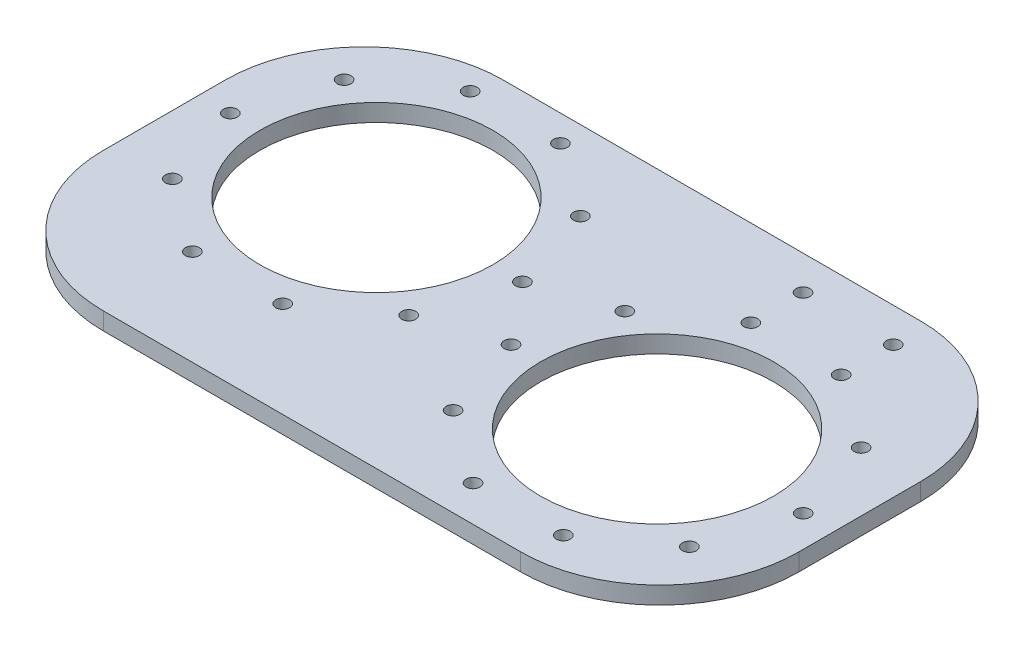
ISO-10303-21;
HEADER;
FILE_DESCRIPTION(('STEP AP214'),'2;1');
FILE_NAME('part.step','',(''),(''),'','','');
FILE_SCHEMA(('AUTOMOTIVE_DESIGN { 1 0 10303 214 1 1 1 1 }'));
ENDSEC;
DATA;
#1=APPLICATION_CONTEXT('core data for automotive mechanical design processes');
#2=APPLICATION_PROTOCOL_DEFINITION('international standard','automotive_design',2000,#1);
#3=PRODUCT_CONTEXT('',#1,'mechanical');
#4=PRODUCT('Part','Part','',(#3));
#5=PRODUCT_RELATED_PRODUCT_CATEGORY('part','',(#4));
#6=PRODUCT_DEFINITION_FORMATION('','',#4);
#7=PRODUCT_DEFINITION_CONTEXT('part definition',#1,'design');
#8=PRODUCT_DEFINITION('design','',#6,#7);
#9=PRODUCT_DEFINITION_SHAPE('','',#8);
#10=(LENGTH_UNIT() NAMED_UNIT(*) SI_UNIT(.MILLI.,.METRE.));
#11=(NAMED_UNIT(*) PLANE_ANGLE_UNIT() SI_UNIT($,.RADIAN.));
#12=(NAMED_UNIT(*) SI_UNIT($,.STERADIAN.) SOLID_ANGLE_UNIT());
#13=UNCERTAINTY_MEASURE_WITH_UNIT(LENGTH_MEASURE(1.E-05),#10,'distance_accuracy_value','');
#14=(GEOMETRIC_REPRESENTATION_CONTEXT(3) GLOBAL_UNCERTAINTY_ASSIGNED_CONTEXT((#13)) GLOBAL_UNIT_ASSIGNED_CONTEXT((#10,
#11,#12)) REPRESENTATION_CONTEXT('',''));
#15=CARTESIAN_POINT('',(0.,0.,0.));
#16=DIRECTION('',(0.,0.,1.));
#17=DIRECTION('',(1.,0.,0.));
#18=AXIS2_PLACEMENT_3D('',#15,#16,#17);
#19=CARTESIAN_POINT('',(-60.,5.,-17.5));
#20=DIRECTION('',(0.,-1.,0.));
#21=DIRECTION('',(0.,0.,-1.));
#22=AXIS2_PLACEMENT_3D('',#19,#20,#21);
#23=PLANE('',#22);
#24=CARTESIAN_POINT('',(36.021286236252,5.,-47.6643295749676));
#25=DIRECTION('',(0.,1.,0.));
#26=DIRECTION('',(0.,0.,1.));
#27=AXIS2_PLACEMENT_3D('',#24,#25,#26);
#28=CIRCLE('',#27,2.);
#29=CARTESIAN_POINT('',(36.021286236252,5.,-45.6643295749676));
#30=VERTEX_POINT('',#29);
#31=EDGE_CURVE('E270',#30,#30,#28,.T.);
#32=ORIENTED_EDGE('',*,*,#31,.F.);
#33=EDGE_LOOP('',(#32));
#34=FACE_BOUND('',#33,.T.);
#35=CARTESIAN_POINT('',(61.9787137637477,5.,-47.6643295749676));
#36=DIRECTION('',(0.,1.,0.));
#37=DIRECTION('',(0.,0.,1.));
#38=AXIS2_PLACEMENT_3D('',#35,#36,#37);
#39=CIRCLE('',#38,2.);
#40=CARTESIAN_POINT('',(61.9787137637477,5.,-45.6643295749676));
#41=VERTEX_POINT('',#40);
#42=EDGE_CURVE('E317',#41,#41,#39,.T.);
#43=ORIENTED_EDGE('',*,*,#42,.F.);
#44=EDGE_LOOP('',(#43));
#45=FACE_BOUND('',#44,.T.);
#46=CARTESIAN_POINT('',(-15.0212862362519,5.,14.6869805962834));
#47=DIRECTION('',(0.,1.,0.));
#48=DIRECTION('',(-0.587785252292462,0.,0.809016994374955));
#49=AXIS2_PLACEMENT_3D('',#46,#47,#48);
#50=CIRCLE('',#49,2.);
#51=CARTESIAN_POINT('',(-16.1968567408368,5.,16.3050145850333));
#52=VERTEX_POINT('',#51);
#53=EDGE_CURVE('E269',#52,#52,#50,.T.);
#54=ORIENTED_EDGE('',*,*,#53,.F.);
#55=EDGE_LOOP('',(#54));
#56=FACE_BOUND('',#55,.T.);
#57=CARTESIAN_POINT('',(-36.0212862362518,5.,29.9443736843963));
#58=DIRECTION('',(0.,1.,0.));
#59=DIRECTION('',(-0.95105651629515,0.,0.309016994374958));
#60=AXIS2_PLACEMENT_3D('',#57,#58,#59);
#61=CIRCLE('',#60,2.);
#62=CARTESIAN_POINT('',(-37.9233992688421,5.,30.5624076731462));
#63=VERTEX_POINT('',#62);
#64=EDGE_CURVE('E276',#63,#63,#61,.T.);
#65=ORIENTED_EDGE('',*,*,#64,.F.);
#66=EDGE_LOOP('',(#65));
#67=FACE_BOUND('',#66,.T.);
#68=CARTESIAN_POINT('',(-61.9787137637474,5.,29.9443736843966));
#69=DIRECTION('',(0.,1.,0.));
#70=DIRECTION('',(-0.951056516295157,0.,-0.309016994374938));
#71=AXIS2_PLACEMENT_3D('',#68,#69,#70);
#72=CIRCLE('',#71,2.);
#73=CARTESIAN_POINT('',(-63.8808267963377,5.,29.3263396956467));
#74=VERTEX_POINT('',#73);
#75=EDGE_CURVE('E282',#74,#74,#72,.T.);
#76=ORIENTED_EDGE('',*,*,#75,.F.);
#77=EDGE_LOOP('',(#76));
#78=FACE_BOUND('',#77,.T.);
#79=CARTESIAN_POINT('',(-82.9787137637476,5.,14.6869805962842));
#80=DIRECTION('',(0.,1.,0.));
#81=DIRECTION('',(-0.58778525229248,0.,-0.809016994374942));
#82=AXIS2_PLACEMENT_3D('',#79,#80,#81);
#83=CIRCLE('',#82,2.);
#84=CARTESIAN_POINT('',(-84.1542842683325,5.,13.0689466075343));
#85=VERTEX_POINT('',#84);
#86=EDGE_CURVE('E288',#85,#85,#83,.T.);
#87=ORIENTED_EDGE('',*,*,#86,.F.);
#88=EDGE_LOOP('',(#87));
#89=FACE_BOUND('',#88,.T.);
#90=CARTESIAN_POINT('',(-91.,5.,-10.));
#91=DIRECTION('',(0.,1.,0.));
#92=DIRECTION('',(0.,0.,-1.));
#93=AXIS2_PLACEMENT_3D('',#90,#91,#92);
#94=CIRCLE('',#93,2.);
#95=CARTESIAN_POINT('',(-91.,5.,-12.));
#96=VERTEX_POINT('',#95);
#97=EDGE_CURVE('E294',#96,#96,#94,.T.);
#98=ORIENTED_EDGE('',*,*,#97,.F.);
#99=EDGE_LOOP('',(#98));
#100=FACE_BOUND('',#99,.T.);
#101=CARTESIAN_POINT('',(-82.9787137637479,5.,-34.6869805962837));
#102=DIRECTION('',(0.,1.,0.));
#103=DIRECTION('',(0.587785252292469,0.,-0.809016994374951));
#104=AXIS2_PLACEMENT_3D('',#101,#102,#103);
#105=CIRCLE('',#104,2.);
#106=CARTESIAN_POINT('',(-81.803143259163,5.,-36.3050145850336));
#107=VERTEX_POINT('',#106);
#108=EDGE_CURVE('E300',#107,#107,#105,.T.);
#109=ORIENTED_EDGE('',*,*,#108,.F.);
#110=EDGE_LOOP('',(#109));
#111=FACE_BOUND('',#110,.T.);
#112=CARTESIAN_POINT('',(-61.978713763748,5.,-49.9443736843964));
#113=DIRECTION('',(0.,1.,0.));
#114=DIRECTION('',(0.951056516295152,0.,-0.309016994374952));
#115=AXIS2_PLACEMENT_3D('',#112,#113,#114);
#116=CIRCLE('',#115,2.);
#117=CARTESIAN_POINT('',(-60.0766007311577,5.,-50.5624076731463));
#118=VERTEX_POINT('',#117);
#119=EDGE_CURVE('E306',#118,#118,#116,.T.);
#120=ORIENTED_EDGE('',*,*,#119,.F.);
#121=EDGE_LOOP('',(#120));
#122=FACE_BOUND('',#121,.T.);
#123=CARTESIAN_POINT('',(-36.0212862362523,5.,-49.9443736843965));
#124=DIRECTION('',(0.,1.,0.));
#125=DIRECTION('',(0.951056516295155,0.,0.309016994374945));
#126=AXIS2_PLACEMENT_3D('',#123,#124,#125);
#127=CIRCLE('',#126,2.);
#128=CARTESIAN_POINT('',(-34.119173203662,5.,-49.3263396956466));
#129=VERTEX_POINT('',#128);
#130=EDGE_CURVE('E263',#129,#129,#127,.T.);
#131=ORIENTED_EDGE('',*,*,#130,.F.);
#132=EDGE_LOOP('',(#131));
#133=FACE_BOUND('',#132,.T.);
#134=CARTESIAN_POINT('',(-15.0212862362522,5.,-34.6869805962839));
#135=DIRECTION('',(0.,1.,0.));
#136=DIRECTION('',(0.587785252292474,0.,0.809016994374947));
#137=AXIS2_PLACEMENT_3D('',#134,#135,#136);
#138=CIRCLE('',#137,2.);
#139=CARTESIAN_POINT('',(-13.8457157316673,5.,-33.068946607534));
#140=VERTEX_POINT('',#139);
#141=EDGE_CURVE('E257',#140,#140,#138,.T.);
#142=ORIENTED_EDGE('',*,*,#141,.F.);
#143=EDGE_LOOP('',(#142));
#144=FACE_BOUND('',#143,.T.);
#145=CARTESIAN_POINT('',(-7.,5.,-10.));
#146=DIRECTION('',(0.,1.,0.));
#147=DIRECTION('',(0.,0.,1.));
#148=AXIS2_PLACEMENT_3D('',#145,#146,#147);
#149=CIRCLE('',#148,2.);
#150=CARTESIAN_POINT('',(-7.,5.,-8.));
#151=VERTEX_POINT('',#150);
#152=EDGE_CURVE('E210',#151,#151,#149,.T.);
#153=ORIENTED_EDGE('',*,*,#152,.F.);
#154=EDGE_LOOP('',(#153));
#155=FACE_BOUND('',#154,.T.);
#156=CARTESIAN_POINT('',(82.9787137637481,5.,31.9670247057123));
#157=DIRECTION('',(0.,1.,0.));
#158=DIRECTION('',(-0.587785252292462,0.,0.809016994374955));
#159=AXIS2_PLACEMENT_3D('',#156,#157,#158);
#160=CIRCLE('',#159,2.);
#161=CARTESIAN_POINT('',(81.8031432591632,5.,33.5850586944622));
#162=VERTEX_POINT('',#161);
#163=EDGE_CURVE('E209',#162,#162,#160,.T.);
#164=ORIENTED_EDGE('',*,*,#163,.F.);
#165=EDGE_LOOP('',(#164));
#166=FACE_BOUND('',#165,.T.);
#167=CARTESIAN_POINT('',(61.9787137637482,5.,47.2244177938252));
#168=DIRECTION('',(0.,1.,0.));
#169=DIRECTION('',(-0.95105651629515,0.,0.309016994374958));
#170=AXIS2_PLACEMENT_3D('',#167,#168,#169);
#171=CIRCLE('',#170,2.);
#172=CARTESIAN_POINT('',(60.0766007311579,5.,47.8424517825751));
#173=VERTEX_POINT('',#172);
#174=EDGE_CURVE('E216',#173,#173,#171,.T.);
#175=ORIENTED_EDGE('',*,*,#174,.F.);
#176=EDGE_LOOP('',(#175));
#177=FACE_BOUND('',#176,.T.);
#178=CARTESIAN_POINT('',(36.0212862362526,5.,47.2244177938254));
#179=DIRECTION('',(0.,1.,0.));
#180=DIRECTION('',(-0.951056516295157,0.,-0.309016994374938));
#181=AXIS2_PLACEMENT_3D('',#178,#179,#180);
#182=CIRCLE('',#181,2.);
#183=CARTESIAN_POINT('',(34.1191732036623,5.,46.6063838050756));
#184=VERTEX_POINT('',#183);
#185=EDGE_CURVE('E222',#184,#184,#182,.T.);
#186=ORIENTED_EDGE('',*,*,#185,.F.);
#187=EDGE_LOOP('',(#186));
#188=FACE_BOUND('',#187,.T.);
#189=CARTESIAN_POINT('',(15.0212862362524,5.,31.967024705713));
#190=DIRECTION('',(0.,1.,0.));
#191=DIRECTION('',(-0.58778525229248,0.,-0.809016994374942));
#192=AXIS2_PLACEMENT_3D('',#189,#190,#191);
#193=CIRCLE('',#192,2.);
#194=CARTESIAN_POINT('',(13.8457157316675,5.,30.3489907169632));
#195=VERTEX_POINT('',#194);
#196=EDGE_CURVE('E228',#195,#195,#193,.T.);
#197=ORIENTED_EDGE('',*,*,#196,.F.);
#198=EDGE_LOOP('',(#197));
#199=FACE_BOUND('',#198,.T.);
#200=CARTESIAN_POINT('',(7.00000000000001,5.,7.28004410942886));
#201=DIRECTION('',(0.,1.,0.));
#202=DIRECTION('',(0.,0.,-1.));
#203=AXIS2_PLACEMENT_3D('',#200,#201,#202);
#204=CIRCLE('',#203,2.);
#205=CARTESIAN_POINT('',(7.00000000000001,5.,5.28004410942887));
#206=VERTEX_POINT('',#205);
#207=EDGE_CURVE('E234',#206,#206,#204,.T.);
#208=ORIENTED_EDGE('',*,*,#207,.F.);
#209=EDGE_LOOP('',(#208));
#210=FACE_BOUND('',#209,.T.);
#211=CARTESIAN_POINT('',(15.0212862362521,5.,-17.4069364868548));
#212=DIRECTION('',(0.,1.,0.));
#213=DIRECTION('',(0.587785252292469,0.,-0.809016994374951));
#214=AXIS2_PLACEMENT_3D('',#211,#212,#213);
#215=CIRCLE('',#214,2.);
#216=CARTESIAN_POINT('',(16.196856740837,5.,-19.0249704756047));
#217=VERTEX_POINT('',#216);
#218=EDGE_CURVE('E240',#217,#217,#215,.T.);
#219=ORIENTED_EDGE('',*,*,#218,.F.);
#220=EDGE_LOOP('',(#219));
#221=FACE_BOUND('',#220,.T.);
#222=CARTESIAN_POINT('',(36.021286236252,5.,-32.6643295749675));
#223=DIRECTION('',(0.,1.,0.));
#224=DIRECTION('',(0.951056516295152,0.,-0.309016994374952));
#225=AXIS2_PLACEMENT_3D('',#222,#223,#224);
#226=CIRCLE('',#225,2.);
#227=CARTESIAN_POINT('',(37.9233992688423,5.,-33.2823635637174));
#228=VERTEX_POINT('',#227);
#229=EDGE_CURVE('E246',#228,#228,#226,.T.);
#230=ORIENTED_EDGE('',*,*,#229,.F.);
#231=EDGE_LOOP('',(#230));
#232=FACE_BOUND('',#231,.T.);
#233=CARTESIAN_POINT('',(61.9787137637477,5.,-32.6643295749676));
#234=DIRECTION('',(0.,1.,0.));
#235=DIRECTION('',(0.951056516295155,0.,0.309016994374945));
#236=AXIS2_PLACEMENT_3D('',#233,#234,#235);
#237=CIRCLE('',#236,2.);
#238=CARTESIAN_POINT('',(63.880826796338,5.,-32.0462955862177));
#239=VERTEX_POINT('',#238);
#240=EDGE_CURVE('E203',#239,#239,#237,.T.);
#241=ORIENTED_EDGE('',*,*,#240,.F.);
#242=EDGE_LOOP('',(#241));
#243=FACE_BOUND('',#242,.T.);
#244=CARTESIAN_POINT('',(82.9787137637477,5.,-17.4069364868551));
#245=DIRECTION('',(0.,1.,0.));
#246=DIRECTION('',(0.587785252292474,0.,0.809016994374947));
#247=AXIS2_PLACEMENT_3D('',#244,#245,#246);
#248=CIRCLE('',#247,2.);
#249=CARTESIAN_POINT('',(84.1542842683327,5.,-15.7889024981052));
#250=VERTEX_POINT('',#249);
#251=EDGE_CURVE('E197',#250,#250,#248,.T.);
#252=ORIENTED_EDGE('',*,*,#251,.F.);
#253=EDGE_LOOP('',(#252));
#254=FACE_BOUND('',#253,.T.);
#255=CARTESIAN_POINT('',(91.,5.,7.28004410942886));
#256=DIRECTION('',(0.,1.,0.));
#257=DIRECTION('',(0.,0.,1.));
#258=AXIS2_PLACEMENT_3D('',#255,#256,#257);
#259=CIRCLE('',#258,2.);
#260=CARTESIAN_POINT('',(91.,5.,9.28004410942886));
#261=VERTEX_POINT('',#260);
#262=EDGE_CURVE('E191',#261,#261,#259,.T.);
#263=ORIENTED_EDGE('',*,*,#262,.F.);
#264=EDGE_LOOP('',(#263));
#265=FACE_BOUND('',#264,.T.);
#266=CARTESIAN_POINT('',(-60.,5.,-17.5));
#267=DIRECTION('',(0.,1.,0.));
#268=DIRECTION('',(0.,0.,-1.));
#269=AXIS2_PLACEMENT_3D('',#266,#267,#268);
#270=CIRCLE('',#269,40.);
#271=CARTESIAN_POINT('',(-60.,5.,-57.5));
#272=VERTEX_POINT('',#271);
#273=CARTESIAN_POINT('',(-100.,5.,-17.5));
#274=VERTEX_POINT('',#273);
#275=EDGE_CURVE('E148',#272,#274,#270,.T.);
#276=ORIENTED_EDGE('',*,*,#275,.T.);
#277=DIRECTION('',(0.,0.,1.));
#278=VECTOR('',#277,1.);
#279=CARTESIAN_POINT('',(-100.,5.,-17.5));
#280=LINE('',#279,#278);
#281=CARTESIAN_POINT('',(-100.,5.,17.5));
#282=VERTEX_POINT('',#281);
#283=EDGE_CURVE('E96',#274,#282,#280,.T.);
#284=ORIENTED_EDGE('',*,*,#283,.T.);
#285=CARTESIAN_POINT('',(-60.,5.,17.5));
#286=DIRECTION('',(0.,1.,0.));
#287=DIRECTION('',(0.,0.,-1.));
#288=AXIS2_PLACEMENT_3D('',#285,#286,#287);
#289=CIRCLE('',#288,40.);
#290=CARTESIAN_POINT('',(-60.,5.,57.5));
#291=VERTEX_POINT('',#290);
#292=EDGE_CURVE('E163',#282,#291,#289,.T.);
#293=ORIENTED_EDGE('',*,*,#292,.T.);
#294=DIRECTION('',(1.,0.,0.));
#295=VECTOR('',#294,1.);
#296=CARTESIAN_POINT('',(-60.,5.,57.5));
#297=LINE('',#296,#295);
#298=CARTESIAN_POINT('',(60.,5.,57.5));
#299=VERTEX_POINT('',#298);
#300=EDGE_CURVE('E176',#291,#299,#297,.T.);
#301=ORIENTED_EDGE('',*,*,#300,.T.);
#302=CARTESIAN_POINT('',(60.,5.,17.5));
#303=DIRECTION('',(0.,1.,0.));
#304=DIRECTION('',(0.,0.,1.));
#305=AXIS2_PLACEMENT_3D('',#302,#303,#304);
#306=CIRCLE('',#305,40.);
#307=CARTESIAN_POINT('',(100.,5.,17.5));
#308=VERTEX_POINT('',#307);
#309=EDGE_CURVE('E115',#299,#308,#306,.T.);
#310=ORIENTED_EDGE('',*,*,#309,.T.);
#311=DIRECTION('',(0.,0.,-1.));
#312=VECTOR('',#311,1.);
#313=CARTESIAN_POINT('',(100.,5.,-17.5));
#314=LINE('',#313,#312);
#315=CARTESIAN_POINT('',(100.,5.,-17.5));
#316=VERTEX_POINT('',#315);
#317=EDGE_CURVE('E109',#308,#316,#314,.T.);
#318=ORIENTED_EDGE('',*,*,#317,.T.);
#319=CARTESIAN_POINT('',(60.,5.,-17.5));
#320=DIRECTION('',(0.,1.,0.));
#321=DIRECTION('',(0.,0.,1.));
#322=AXIS2_PLACEMENT_3D('',#319,#320,#321);
#323=CIRCLE('',#322,40.);
#324=CARTESIAN_POINT('',(60.,5.,-57.5));
#325=VERTEX_POINT('',#324);
#326=EDGE_CURVE('E113',#316,#325,#323,.T.);
#327=ORIENTED_EDGE('',*,*,#326,.T.);
#328=DIRECTION('',(-1.,0.,0.));
#329=VECTOR('',#328,1.);
#330=CARTESIAN_POINT('',(-60.,5.,-57.5));
#331=LINE('',#330,#329);
#332=EDGE_CURVE('E53',#325,#272,#331,.T.);
#333=ORIENTED_EDGE('',*,*,#332,.T.);
#334=EDGE_LOOP('',(#276,#284,#293,#301,#310,#318,#327,#333));
#335=FACE_BOUND('',#334,.T.);
#336=CARTESIAN_POINT('',(-49.,5.,-10.));
#337=DIRECTION('',(0.,1.,0.));
#338=DIRECTION('',(0.,0.,1.));
#339=AXIS2_PLACEMENT_3D('',#336,#337,#338);
#340=CIRCLE('',#339,33.5);
#341=CARTESIAN_POINT('',(-49.,5.,23.5));
#342=VERTEX_POINT('',#341);
#343=EDGE_CURVE('E137',#342,#342,#340,.T.);
#344=ORIENTED_EDGE('',*,*,#343,.F.);
#345=EDGE_LOOP('',(#344));
#346=FACE_BOUND('',#345,.T.);
#347=CARTESIAN_POINT('',(49.,5.,7.28004410942886));
#348=DIRECTION('',(0.,1.,0.));
#349=DIRECTION('',(0.,0.,1.));
#350=AXIS2_PLACEMENT_3D('',#347,#348,#349);
#351=CIRCLE('',#350,33.5);
#352=CARTESIAN_POINT('',(49.,5.,40.7800441094289));
#353=VERTEX_POINT('',#352);
#354=EDGE_CURVE('E185',#353,#353,#351,.T.);
#355=ORIENTED_EDGE('',*,*,#354,.F.);
#356=EDGE_LOOP('',(#355));
#357=FACE_BOUND('',#356,.T.);
#358=ADVANCED_FACE('F36',(#34,#45,#56,#67,#78,#89,#100,#111,#122,#133,#144,#155,#166,#177,#188,
#199,#210,#221,#232,#243,#254,#265,#335,#346,#357),#23,.F.);
#359=CARTESIAN_POINT('',(-60.,0.,-17.5));
#360=DIRECTION('',(0.,-1.,0.));
#361=DIRECTION('',(0.,0.,-1.));
#362=AXIS2_PLACEMENT_3D('',#359,#360,#361);
#363=PLANE('',#362);
#364=CARTESIAN_POINT('',(36.021286236252,0.,-47.6643295749676));
#365=DIRECTION('',(0.,-1.,0.));
#366=DIRECTION('',(0.,0.,-1.));
#367=AXIS2_PLACEMENT_3D('',#364,#365,#366);
#368=CIRCLE('',#367,2.);
#369=CARTESIAN_POINT('',(36.021286236252,0.,-49.6643295749676));
#370=VERTEX_POINT('',#369);
#371=EDGE_CURVE('E320',#370,#370,#368,.F.);
#372=ORIENTED_EDGE('',*,*,#371,.T.);
#373=EDGE_LOOP('',(#372));
#374=FACE_BOUND('',#373,.T.);
#375=CARTESIAN_POINT('',(61.9787137637477,0.,-47.6643295749676));
#376=DIRECTION('',(0.,-1.,0.));
#377=DIRECTION('',(0.,0.,-1.));
#378=AXIS2_PLACEMENT_3D('',#375,#376,#377);
#379=CIRCLE('',#378,2.);
#380=CARTESIAN_POINT('',(61.9787137637477,0.,-49.6643295749676));
#381=VERTEX_POINT('',#380);
#382=EDGE_CURVE('E314',#381,#381,#379,.F.);
#383=ORIENTED_EDGE('',*,*,#382,.T.);
#384=EDGE_LOOP('',(#383));
#385=FACE_BOUND('',#384,.T.);
#386=CARTESIAN_POINT('',(-15.0212862362519,0.,14.6869805962834));
#387=DIRECTION('',(0.,-1.,0.));
#388=DIRECTION('',(0.,0.,-1.));
#389=AXIS2_PLACEMENT_3D('',#386,#387,#388);
#390=CIRCLE('',#389,2.);
#391=CARTESIAN_POINT('',(-15.0212862362519,0.,12.6869805962834));
#392=VERTEX_POINT('',#391);
#393=EDGE_CURVE('E266',#392,#392,#390,.F.);
#394=ORIENTED_EDGE('',*,*,#393,.T.);
#395=EDGE_LOOP('',(#394));
#396=FACE_BOUND('',#395,.T.);
#397=CARTESIAN_POINT('',(-36.0212862362518,0.,29.9443736843963));
#398=DIRECTION('',(0.,-1.,0.));
#399=DIRECTION('',(0.,0.,-1.));
#400=AXIS2_PLACEMENT_3D('',#397,#398,#399);
#401=CIRCLE('',#400,2.);
#402=CARTESIAN_POINT('',(-36.0212862362518,0.,27.9443736843963));
#403=VERTEX_POINT('',#402);
#404=EDGE_CURVE('E273',#403,#403,#401,.F.);
#405=ORIENTED_EDGE('',*,*,#404,.T.);
#406=EDGE_LOOP('',(#405));
#407=FACE_BOUND('',#406,.T.);
#408=CARTESIAN_POINT('',(-61.9787137637474,0.,29.9443736843966));
#409=DIRECTION('',(0.,-1.,0.));
#410=DIRECTION('',(0.,0.,-1.));
#411=AXIS2_PLACEMENT_3D('',#408,#409,#410);
#412=CIRCLE('',#411,2.);
#413=CARTESIAN_POINT('',(-61.9787137637474,0.,27.9443736843966));
#414=VERTEX_POINT('',#413);
#415=EDGE_CURVE('E279',#414,#414,#412,.F.);
#416=ORIENTED_EDGE('',*,*,#415,.T.);
#417=EDGE_LOOP('',(#416));
#418=FACE_BOUND('',#417,.T.);
#419=CARTESIAN_POINT('',(-82.9787137637476,0.,14.6869805962842));
#420=DIRECTION('',(0.,-1.,0.));
#421=DIRECTION('',(0.,0.,-1.));
#422=AXIS2_PLACEMENT_3D('',#419,#420,#421);
#423=CIRCLE('',#422,2.);
#424=CARTESIAN_POINT('',(-82.9787137637476,0.,12.6869805962842));
#425=VERTEX_POINT('',#424);
#426=EDGE_CURVE('E285',#425,#425,#423,.F.);
#427=ORIENTED_EDGE('',*,*,#426,.T.);
#428=EDGE_LOOP('',(#427));
#429=FACE_BOUND('',#428,.T.);
#430=CARTESIAN_POINT('',(-91.,0.,-10.));
#431=DIRECTION('',(0.,-1.,0.));
#432=DIRECTION('',(0.,0.,-1.));
#433=AXIS2_PLACEMENT_3D('',#430,#431,#432);
#434=CIRCLE('',#433,2.);
#435=CARTESIAN_POINT('',(-91.,0.,-12.));
#436=VERTEX_POINT('',#435);
#437=EDGE_CURVE('E291',#436,#436,#434,.F.);
#438=ORIENTED_EDGE('',*,*,#437,.T.);
#439=EDGE_LOOP('',(#438));
#440=FACE_BOUND('',#439,.T.);
#441=CARTESIAN_POINT('',(-82.9787137637479,0.,-34.6869805962837));
#442=DIRECTION('',(0.,-1.,0.));
#443=DIRECTION('',(0.,0.,-1.));
#444=AXIS2_PLACEMENT_3D('',#441,#442,#443);
#445=CIRCLE('',#444,2.);
#446=CARTESIAN_POINT('',(-82.9787137637479,0.,-36.6869805962837));
#447=VERTEX_POINT('',#446);
#448=EDGE_CURVE('E297',#447,#447,#445,.F.);
#449=ORIENTED_EDGE('',*,*,#448,.T.);
#450=EDGE_LOOP('',(#449));
#451=FACE_BOUND('',#450,.T.);
#452=CARTESIAN_POINT('',(-61.978713763748,0.,-49.9443736843964));
#453=DIRECTION('',(0.,-1.,0.));
#454=DIRECTION('',(0.,0.,-1.));
#455=AXIS2_PLACEMENT_3D('',#452,#453,#454);
#456=CIRCLE('',#455,2.);
#457=CARTESIAN_POINT('',(-61.978713763748,0.,-51.9443736843964));
#458=VERTEX_POINT('',#457);
#459=EDGE_CURVE('E303',#458,#458,#456,.F.);
#460=ORIENTED_EDGE('',*,*,#459,.T.);
#461=EDGE_LOOP('',(#460));
#462=FACE_BOUND('',#461,.T.);
#463=CARTESIAN_POINT('',(-36.0212862362523,0.,-49.9443736843965));
#464=DIRECTION('',(0.,-1.,0.));
#465=DIRECTION('',(0.,0.,-1.));
#466=AXIS2_PLACEMENT_3D('',#463,#464,#465);
#467=CIRCLE('',#466,2.);
#468=CARTESIAN_POINT('',(-36.0212862362523,0.,-51.9443736843965));
#469=VERTEX_POINT('',#468);
#470=EDGE_CURVE('E309',#469,#469,#467,.F.);
#471=ORIENTED_EDGE('',*,*,#470,.T.);
#472=EDGE_LOOP('',(#471));
#473=FACE_BOUND('',#472,.T.);
#474=CARTESIAN_POINT('',(-15.0212862362522,0.,-34.6869805962839));
#475=DIRECTION('',(0.,-1.,0.));
#476=DIRECTION('',(0.,0.,-1.));
#477=AXIS2_PLACEMENT_3D('',#474,#475,#476);
#478=CIRCLE('',#477,2.);
#479=CARTESIAN_POINT('',(-15.0212862362522,0.,-36.6869805962839));
#480=VERTEX_POINT('',#479);
#481=EDGE_CURVE('E260',#480,#480,#478,.F.);
#482=ORIENTED_EDGE('',*,*,#481,.T.);
#483=EDGE_LOOP('',(#482));
#484=FACE_BOUND('',#483,.T.);
#485=CARTESIAN_POINT('',(-7.,0.,-10.));
#486=DIRECTION('',(0.,-1.,0.));
#487=DIRECTION('',(0.,0.,-1.));
#488=AXIS2_PLACEMENT_3D('',#485,#486,#487);
#489=CIRCLE('',#488,2.);
#490=CARTESIAN_POINT('',(-7.,0.,-12.));
#491=VERTEX_POINT('',#490);
#492=EDGE_CURVE('E254',#491,#491,#489,.F.);
#493=ORIENTED_EDGE('',*,*,#492,.T.);
#494=EDGE_LOOP('',(#493));
#495=FACE_BOUND('',#494,.T.);
#496=CARTESIAN_POINT('',(82.9787137637481,0.,31.9670247057123));
#497=DIRECTION('',(0.,-1.,0.));
#498=DIRECTION('',(0.,0.,-1.));
#499=AXIS2_PLACEMENT_3D('',#496,#497,#498);
#500=CIRCLE('',#499,2.);
#501=CARTESIAN_POINT('',(82.9787137637481,0.,29.9670247057123));
#502=VERTEX_POINT('',#501);
#503=EDGE_CURVE('E206',#502,#502,#500,.F.);
#504=ORIENTED_EDGE('',*,*,#503,.T.);
#505=EDGE_LOOP('',(#504));
#506=FACE_BOUND('',#505,.T.);
#507=CARTESIAN_POINT('',(61.9787137637482,0.,47.2244177938252));
#508=DIRECTION('',(0.,-1.,0.));
#509=DIRECTION('',(0.,0.,-1.));
#510=AXIS2_PLACEMENT_3D('',#507,#508,#509);
#511=CIRCLE('',#510,2.);
#512=CARTESIAN_POINT('',(61.9787137637482,0.,45.2244177938252));
#513=VERTEX_POINT('',#512);
#514=EDGE_CURVE('E213',#513,#513,#511,.F.);
#515=ORIENTED_EDGE('',*,*,#514,.T.);
#516=EDGE_LOOP('',(#515));
#517=FACE_BOUND('',#516,.T.);
#518=CARTESIAN_POINT('',(36.0212862362526,0.,47.2244177938254));
#519=DIRECTION('',(0.,-1.,0.));
#520=DIRECTION('',(0.,0.,-1.));
#521=AXIS2_PLACEMENT_3D('',#518,#519,#520);
#522=CIRCLE('',#521,2.);
#523=CARTESIAN_POINT('',(36.0212862362526,0.,45.2244177938254));
#524=VERTEX_POINT('',#523);
#525=EDGE_CURVE('E219',#524,#524,#522,.F.);
#526=ORIENTED_EDGE('',*,*,#525,.T.);
#527=EDGE_LOOP('',(#526));
#528=FACE_BOUND('',#527,.T.);
#529=CARTESIAN_POINT('',(15.0212862362524,0.,31.967024705713));
#530=DIRECTION('',(0.,-1.,0.));
#531=DIRECTION('',(0.,0.,-1.));
#532=AXIS2_PLACEMENT_3D('',#529,#530,#531);
#533=CIRCLE('',#532,2.);
#534=CARTESIAN_POINT('',(15.0212862362524,0.,29.967024705713));
#535=VERTEX_POINT('',#534);
#536=EDGE_CURVE('E225',#535,#535,#533,.F.);
#537=ORIENTED_EDGE('',*,*,#536,.T.);
#538=EDGE_LOOP('',(#537));
#539=FACE_BOUND('',#538,.T.);
#540=CARTESIAN_POINT('',(7.00000000000001,0.,7.28004410942886));
#541=DIRECTION('',(0.,-1.,0.));
#542=DIRECTION('',(0.,0.,-1.));
#543=AXIS2_PLACEMENT_3D('',#540,#541,#542);
#544=CIRCLE('',#543,2.);
#545=CARTESIAN_POINT('',(7.00000000000001,0.,5.28004410942887));
#546=VERTEX_POINT('',#545);
#547=EDGE_CURVE('E231',#546,#546,#544,.F.);
#548=ORIENTED_EDGE('',*,*,#547,.T.);
#549=EDGE_LOOP('',(#548));
#550=FACE_BOUND('',#549,.T.);
#551=CARTESIAN_POINT('',(15.0212862362521,0.,-17.4069364868548));
#552=DIRECTION('',(0.,-1.,0.));
#553=DIRECTION('',(0.,0.,-1.));
#554=AXIS2_PLACEMENT_3D('',#551,#552,#553);
#555=CIRCLE('',#554,2.);
#556=CARTESIAN_POINT('',(15.0212862362521,0.,-19.4069364868548));
#557=VERTEX_POINT('',#556);
#558=EDGE_CURVE('E237',#557,#557,#555,.F.);
#559=ORIENTED_EDGE('',*,*,#558,.T.);
#560=EDGE_LOOP('',(#559));
#561=FACE_BOUND('',#560,.T.);
#562=CARTESIAN_POINT('',(36.021286236252,0.,-32.6643295749675));
#563=DIRECTION('',(0.,-1.,0.));
#564=DIRECTION('',(0.,0.,-1.));
#565=AXIS2_PLACEMENT_3D('',#562,#563,#564);
#566=CIRCLE('',#565,2.);
#567=CARTESIAN_POINT('',(36.021286236252,0.,-34.6643295749675));
#568=VERTEX_POINT('',#567);
#569=EDGE_CURVE('E243',#568,#568,#566,.F.);
#570=ORIENTED_EDGE('',*,*,#569,.T.);
#571=EDGE_LOOP('',(#570));
#572=FACE_BOUND('',#571,.T.);
#573=CARTESIAN_POINT('',(61.9787137637477,0.,-32.6643295749676));
#574=DIRECTION('',(0.,-1.,0.));
#575=DIRECTION('',(0.,0.,-1.));
#576=AXIS2_PLACEMENT_3D('',#573,#574,#575);
#577=CIRCLE('',#576,2.);
#578=CARTESIAN_POINT('',(61.9787137637477,0.,-34.6643295749676));
#579=VERTEX_POINT('',#578);
#580=EDGE_CURVE('E249',#579,#579,#577,.F.);
#581=ORIENTED_EDGE('',*,*,#580,.T.);
#582=EDGE_LOOP('',(#581));
#583=FACE_BOUND('',#582,.T.);
#584=CARTESIAN_POINT('',(82.9787137637477,0.,-17.4069364868551));
#585=DIRECTION('',(0.,-1.,0.));
#586=DIRECTION('',(0.,0.,-1.));
#587=AXIS2_PLACEMENT_3D('',#584,#585,#586);
#588=CIRCLE('',#587,2.);
#589=CARTESIAN_POINT('',(82.9787137637477,0.,-19.406936486855));
#590=VERTEX_POINT('',#589);
#591=EDGE_CURVE('E200',#590,#590,#588,.F.);
#592=ORIENTED_EDGE('',*,*,#591,.T.);
#593=EDGE_LOOP('',(#592));
#594=FACE_BOUND('',#593,.T.);
#595=CARTESIAN_POINT('',(91.,0.,7.28004410942886));
#596=DIRECTION('',(0.,-1.,0.));
#597=DIRECTION('',(0.,0.,-1.));
#598=AXIS2_PLACEMENT_3D('',#595,#596,#597);
#599=CIRCLE('',#598,2.);
#600=CARTESIAN_POINT('',(91.,0.,5.28004410942887));
#601=VERTEX_POINT('',#600);
#602=EDGE_CURVE('E194',#601,#601,#599,.F.);
#603=ORIENTED_EDGE('',*,*,#602,.T.);
#604=EDGE_LOOP('',(#603));
#605=FACE_BOUND('',#604,.T.);
#606=CARTESIAN_POINT('',(-49.,0.,-10.));
#607=DIRECTION('',(0.,1.,0.));
#608=DIRECTION('',(0.,0.,1.));
#609=AXIS2_PLACEMENT_3D('',#606,#607,#608);
#610=CIRCLE('',#609,33.5);
#611=CARTESIAN_POINT('',(-49.,0.,23.5));
#612=VERTEX_POINT('',#611);
#613=EDGE_CURVE('E182',#612,#612,#610,.T.);
#614=ORIENTED_EDGE('',*,*,#613,.T.);
#615=EDGE_LOOP('',(#614));
#616=FACE_BOUND('',#615,.T.);
#617=CARTESIAN_POINT('',(-60.,0.,-17.5));
#618=DIRECTION('',(0.,1.,0.));
#619=DIRECTION('',(0.,0.,-1.));
#620=AXIS2_PLACEMENT_3D('',#617,#618,#619);
#621=CIRCLE('',#620,40.);
#622=CARTESIAN_POINT('',(-60.,0.,-57.5));
#623=VERTEX_POINT('',#622);
#624=CARTESIAN_POINT('',(-100.,0.,-17.5));
#625=VERTEX_POINT('',#624);
#626=EDGE_CURVE('E133',#623,#625,#621,.T.);
#627=ORIENTED_EDGE('',*,*,#626,.F.);
#628=DIRECTION('',(-1.,0.,0.));
#629=VECTOR('',#628,1.);
#630=CARTESIAN_POINT('',(-60.,0.,-57.5));
#631=LINE('',#630,#629);
#632=CARTESIAN_POINT('',(60.,0.,-57.5));
#633=VERTEX_POINT('',#632);
#634=EDGE_CURVE('E88',#633,#623,#631,.T.);
#635=ORIENTED_EDGE('',*,*,#634,.F.);
#636=CARTESIAN_POINT('',(60.,0.,-17.5));
#637=DIRECTION('',(0.,1.,0.));
#638=DIRECTION('',(0.,0.,1.));
#639=AXIS2_PLACEMENT_3D('',#636,#637,#638);
#640=CIRCLE('',#639,40.);
#641=CARTESIAN_POINT('',(100.,0.,-17.5));
#642=VERTEX_POINT('',#641);
#643=EDGE_CURVE('E82',#642,#633,#640,.T.);
#644=ORIENTED_EDGE('',*,*,#643,.F.);
#645=DIRECTION('',(0.,0.,-1.));
#646=VECTOR('',#645,1.);
#647=CARTESIAN_POINT('',(100.,0.,-17.5));
#648=LINE('',#647,#646);
#649=CARTESIAN_POINT('',(100.,0.,17.5));
#650=VERTEX_POINT('',#649);
#651=EDGE_CURVE('E123',#650,#642,#648,.T.);
#652=ORIENTED_EDGE('',*,*,#651,.F.);
#653=CARTESIAN_POINT('',(60.,0.,17.5));
#654=DIRECTION('',(0.,1.,0.));
#655=DIRECTION('',(0.,0.,1.));
#656=AXIS2_PLACEMENT_3D('',#653,#654,#655);
#657=CIRCLE('',#656,40.);
#658=CARTESIAN_POINT('',(60.,0.,57.5));
#659=VERTEX_POINT('',#658);
#660=EDGE_CURVE('E143',#659,#650,#657,.T.);
#661=ORIENTED_EDGE('',*,*,#660,.F.);
#662=DIRECTION('',(1.,0.,0.));
#663=VECTOR('',#662,1.);
#664=CARTESIAN_POINT('',(-60.,0.,57.5));
#665=LINE('',#664,#663);
#666=CARTESIAN_POINT('',(-60.,0.,57.5));
#667=VERTEX_POINT('',#666);
#668=EDGE_CURVE('E141',#667,#659,#665,.T.);
#669=ORIENTED_EDGE('',*,*,#668,.F.);
#670=CARTESIAN_POINT('',(-60.,0.,17.5));
#671=DIRECTION('',(0.,1.,0.));
#672=DIRECTION('',(0.,0.,-1.));
#673=AXIS2_PLACEMENT_3D('',#670,#671,#672);
#674=CIRCLE('',#673,40.);
#675=CARTESIAN_POINT('',(-100.,0.,17.5));
#676=VERTEX_POINT('',#675);
#677=EDGE_CURVE('E139',#676,#667,#674,.T.);
#678=ORIENTED_EDGE('',*,*,#677,.F.);
#679=DIRECTION('',(0.,0.,1.));
#680=VECTOR('',#679,1.);
#681=CARTESIAN_POINT('',(-100.,0.,-17.5));
#682=LINE('',#681,#680);
#683=EDGE_CURVE('E136',#625,#676,#682,.T.);
#684=ORIENTED_EDGE('',*,*,#683,.F.);
#685=EDGE_LOOP('',(#627,#635,#644,#652,#661,#669,#678,#684));
#686=FACE_BOUND('',#685,.T.);
#687=CARTESIAN_POINT('',(49.,0.,7.28004410942886));
#688=DIRECTION('',(0.,1.,0.));
#689=DIRECTION('',(0.,0.,1.));
#690=AXIS2_PLACEMENT_3D('',#687,#688,#689);
#691=CIRCLE('',#690,33.5);
#692=CARTESIAN_POINT('',(49.,0.,40.7800441094289));
#693=VERTEX_POINT('',#692);
#694=EDGE_CURVE('E188',#693,#693,#691,.T.);
#695=ORIENTED_EDGE('',*,*,#694,.T.);
#696=EDGE_LOOP('',(#695));
#697=FACE_BOUND('',#696,.T.);
#698=ADVANCED_FACE('F167',(#374,#385,#396,#407,#418,#429,#440,#451,#462,#473,#484,#495,#506,
#517,#528,#539,#550,#561,#572,#583,#594,#605,#616,#686,#697),#363,.T.);
#699=CARTESIAN_POINT('',(-60.,5.,-17.5));
#700=DIRECTION('',(0.,-1.,0.));
#701=DIRECTION('',(0.,0.,-1.));
#702=AXIS2_PLACEMENT_3D('',#699,#700,#701);
#703=CYLINDRICAL_SURFACE('',#702,40.);
#704=ORIENTED_EDGE('',*,*,#626,.T.);
#705=DIRECTION('',(0.,-1.,0.));
#706=VECTOR('',#705,1.);
#707=CARTESIAN_POINT('',(-100.,5.,-17.5));
#708=LINE('',#707,#706);
#709=EDGE_CURVE('E11',#274,#625,#708,.T.);
#710=ORIENTED_EDGE('',*,*,#709,.F.);
#711=ORIENTED_EDGE('',*,*,#275,.F.);
#712=DIRECTION('',(0.,-1.,0.));
#713=VECTOR('',#712,1.);
#714=CARTESIAN_POINT('',(-60.,5.,-57.5));
#715=LINE('',#714,#713);
#716=EDGE_CURVE('E129',#272,#623,#715,.T.);
#717=ORIENTED_EDGE('',*,*,#716,.T.);
#718=EDGE_LOOP('',(#704,#710,#711,#717));
#719=FACE_BOUND('',#718,.T.);
#720=ADVANCED_FACE('F38',(#719),#703,.T.);
#721=CARTESIAN_POINT('',(-100.,5.,-17.5));
#722=DIRECTION('',(1.,0.,0.));
#723=DIRECTION('',(0.,0.,-1.));
#724=AXIS2_PLACEMENT_3D('',#721,#722,#723);
#725=PLANE('',#724);
#726=ORIENTED_EDGE('',*,*,#683,.T.);
#727=DIRECTION('',(0.,-1.,0.));
#728=VECTOR('',#727,1.);
#729=CARTESIAN_POINT('',(-100.,5.,17.5));
#730=LINE('',#729,#728);
#731=EDGE_CURVE('E45',#282,#676,#730,.T.);
#732=ORIENTED_EDGE('',*,*,#731,.F.);
#733=ORIENTED_EDGE('',*,*,#283,.F.);
#734=ORIENTED_EDGE('',*,*,#709,.T.);
#735=EDGE_LOOP('',(#726,#732,#733,#734));
#736=FACE_BOUND('',#735,.T.);
#737=ADVANCED_FACE('F410',(#736),#725,.F.);
#738=CARTESIAN_POINT('',(-60.,5.,17.5));
#739=DIRECTION('',(0.,-1.,0.));
#740=DIRECTION('',(0.,0.,-1.));
#741=AXIS2_PLACEMENT_3D('',#738,#739,#740);
#742=CYLINDRICAL_SURFACE('',#741,40.);
#743=ORIENTED_EDGE('',*,*,#677,.T.);
#744=DIRECTION('',(0.,-1.,0.));
#745=VECTOR('',#744,1.);
#746=CARTESIAN_POINT('',(-60.,5.,57.5));
#747=LINE('',#746,#745);
#748=EDGE_CURVE('E155',#291,#667,#747,.T.);
#749=ORIENTED_EDGE('',*,*,#748,.F.);
#750=ORIENTED_EDGE('',*,*,#292,.F.);
#751=ORIENTED_EDGE('',*,*,#731,.T.);
#752=EDGE_LOOP('',(#743,#749,#750,#751));
#753=FACE_BOUND('',#752,.T.);
#754=ADVANCED_FACE('F161',(#753),#742,.T.);
#755=CARTESIAN_POINT('',(-60.,5.,57.5));
#756=DIRECTION('',(0.,0.,-1.));
#757=DIRECTION('',(-1.,0.,0.));
#758=AXIS2_PLACEMENT_3D('',#755,#756,#757);
#759=PLANE('',#758);
#760=ORIENTED_EDGE('',*,*,#668,.T.);
#761=DIRECTION('',(0.,-1.,0.));
#762=VECTOR('',#761,1.);
#763=CARTESIAN_POINT('',(60.,5.,57.5));
#764=LINE('',#763,#762);
#765=EDGE_CURVE('E152',#299,#659,#764,.T.);
#766=ORIENTED_EDGE('',*,*,#765,.F.);
#767=ORIENTED_EDGE('',*,*,#300,.F.);
#768=ORIENTED_EDGE('',*,*,#748,.T.);
#769=EDGE_LOOP('',(#760,#766,#767,#768));
#770=FACE_BOUND('',#769,.T.);
#771=ADVANCED_FACE('F172',(#770),#759,.F.);
#772=CARTESIAN_POINT('',(60.,5.,17.5));
#773=DIRECTION('',(0.,-1.,0.));
#774=DIRECTION('',(0.,0.,-1.));
#775=AXIS2_PLACEMENT_3D('',#772,#773,#774);
#776=CYLINDRICAL_SURFACE('',#775,40.);
#777=ORIENTED_EDGE('',*,*,#660,.T.);
#778=DIRECTION('',(0.,-1.,0.));
#779=VECTOR('',#778,1.);
#780=CARTESIAN_POINT('',(100.,5.,17.5));
#781=LINE('',#780,#779);
#782=EDGE_CURVE('E124',#308,#650,#781,.T.);
#783=ORIENTED_EDGE('',*,*,#782,.F.);
#784=ORIENTED_EDGE('',*,*,#309,.F.);
#785=ORIENTED_EDGE('',*,*,#765,.T.);
#786=EDGE_LOOP('',(#777,#783,#784,#785));
#787=FACE_BOUND('',#786,.T.);
#788=ADVANCED_FACE('F175',(#787),#776,.T.);
#789=CARTESIAN_POINT('',(100.,5.,-17.5));
#790=DIRECTION('',(-1.,0.,0.));
#791=DIRECTION('',(0.,0.,1.));
#792=AXIS2_PLACEMENT_3D('',#789,#790,#791);
#793=PLANE('',#792);
#794=ORIENTED_EDGE('',*,*,#651,.T.);
#795=DIRECTION('',(0.,-1.,0.));
#796=VECTOR('',#795,1.);
#797=CARTESIAN_POINT('',(100.,5.,-17.5));
#798=LINE('',#797,#796);
#799=EDGE_CURVE('E120',#316,#642,#798,.T.);
#800=ORIENTED_EDGE('',*,*,#799,.F.);
#801=ORIENTED_EDGE('',*,*,#317,.F.);
#802=ORIENTED_EDGE('',*,*,#782,.T.);
#803=EDGE_LOOP('',(#794,#800,#801,#802));
#804=FACE_BOUND('',#803,.T.);
#805=ADVANCED_FACE('F121',(#804),#793,.F.);
#806=CARTESIAN_POINT('',(60.,5.,-17.5));
#807=DIRECTION('',(0.,-1.,0.));
#808=DIRECTION('',(0.,0.,-1.));
#809=AXIS2_PLACEMENT_3D('',#806,#807,#808);
#810=CYLINDRICAL_SURFACE('',#809,40.);
#811=ORIENTED_EDGE('',*,*,#643,.T.);
#812=DIRECTION('',(0.,-1.,0.));
#813=VECTOR('',#812,1.);
#814=CARTESIAN_POINT('',(60.,5.,-57.5));
#815=LINE('',#814,#813);
#816=EDGE_CURVE('E125',#325,#633,#815,.T.);
#817=ORIENTED_EDGE('',*,*,#816,.F.);
#818=ORIENTED_EDGE('',*,*,#326,.F.);
#819=ORIENTED_EDGE('',*,*,#799,.T.);
#820=EDGE_LOOP('',(#811,#817,#818,#819));
#821=FACE_BOUND('',#820,.T.);
#822=ADVANCED_FACE('F127',(#821),#810,.T.);
#823=CARTESIAN_POINT('',(-60.,5.,-57.5));
#824=DIRECTION('',(0.,0.,1.));
#825=DIRECTION('',(1.,0.,0.));
#826=AXIS2_PLACEMENT_3D('',#823,#824,#825);
#827=PLANE('',#826);
#828=ORIENTED_EDGE('',*,*,#634,.T.);
#829=ORIENTED_EDGE('',*,*,#716,.F.);
#830=ORIENTED_EDGE('',*,*,#332,.F.);
#831=ORIENTED_EDGE('',*,*,#816,.T.);
#832=EDGE_LOOP('',(#828,#829,#830,#831));
#833=FACE_BOUND('',#832,.T.);
#834=ADVANCED_FACE('F393',(#833),#827,.F.);
#835=CARTESIAN_POINT('',(-49.,5.,-10.));
#836=DIRECTION('',(0.,-1.,0.));
#837=DIRECTION('',(0.,0.,-1.));
#838=AXIS2_PLACEMENT_3D('',#835,#836,#837);
#839=CYLINDRICAL_SURFACE('',#838,33.5);
#840=ORIENTED_EDGE('',*,*,#343,.T.);
#841=EDGE_LOOP('',(#840));
#842=FACE_BOUND('',#841,.T.);
#843=ORIENTED_EDGE('',*,*,#613,.F.);
#844=EDGE_LOOP('',(#843));
#845=FACE_BOUND('',#844,.T.);
#846=ADVANCED_FACE('F386',(#842,#845),#839,.F.);
#847=CARTESIAN_POINT('',(49.,5.,7.28004410942886));
#848=DIRECTION('',(0.,-1.,0.));
#849=DIRECTION('',(0.,0.,-1.));
#850=AXIS2_PLACEMENT_3D('',#847,#848,#849);
#851=CYLINDRICAL_SURFACE('',#850,33.5);
#852=ORIENTED_EDGE('',*,*,#354,.T.);
#853=EDGE_LOOP('',(#852));
#854=FACE_BOUND('',#853,.T.);
#855=ORIENTED_EDGE('',*,*,#694,.F.);
#856=EDGE_LOOP('',(#855));
#857=FACE_BOUND('',#856,.T.);
#858=ADVANCED_FACE('F376',(#854,#857),#851,.F.);
#859=CARTESIAN_POINT('',(91.,-0.00100000000000013,7.28004410942886));
#860=DIRECTION('',(0.,1.,0.));
#861=DIRECTION('',(0.,0.,1.));
#862=AXIS2_PLACEMENT_3D('',#859,#860,#861);
#863=CYLINDRICAL_SURFACE('',#862,2.);
#864=ORIENTED_EDGE('',*,*,#602,.F.);
#865=EDGE_LOOP('',(#864));
#866=FACE_BOUND('',#865,.T.);
#867=ORIENTED_EDGE('',*,*,#262,.T.);
#868=EDGE_LOOP('',(#867));
#869=FACE_BOUND('',#868,.T.);
#870=ADVANCED_FACE('F373',(#866,#869),#863,.F.);
#871=CARTESIAN_POINT('',(82.9787137637477,-0.00100000000000013,-17.4069364868551));
#872=DIRECTION('',(0.,1.,0.));
#873=DIRECTION('',(0.,0.,1.));
#874=AXIS2_PLACEMENT_3D('',#871,#872,#873);
#875=CYLINDRICAL_SURFACE('',#874,2.);
#876=ORIENTED_EDGE('',*,*,#591,.F.);
#877=EDGE_LOOP('',(#876));
#878=FACE_BOUND('',#877,.T.);
#879=ORIENTED_EDGE('',*,*,#251,.T.);
#880=EDGE_LOOP('',(#879));
#881=FACE_BOUND('',#880,.T.);
#882=ADVANCED_FACE('F375',(#878,#881),#875,.F.);
#883=CARTESIAN_POINT('',(61.9787137637477,-0.00100000000000013,-32.6643295749676));
#884=DIRECTION('',(0.,1.,0.));
#885=DIRECTION('',(0.,0.,1.));
#886=AXIS2_PLACEMENT_3D('',#883,#884,#885);
#887=CYLINDRICAL_SURFACE('',#886,2.);
#888=ORIENTED_EDGE('',*,*,#580,.F.);
#889=EDGE_LOOP('',(#888));
#890=FACE_BOUND('',#889,.T.);
#891=ORIENTED_EDGE('',*,*,#240,.T.);
#892=EDGE_LOOP('',(#891));
#893=FACE_BOUND('',#892,.T.);
#894=ADVANCED_FACE('F383',(#890,#893),#887,.F.);
#895=CARTESIAN_POINT('',(36.021286236252,-0.00100000000000013,-32.6643295749675));
#896=DIRECTION('',(0.,1.,0.));
#897=DIRECTION('',(0.,0.,1.));
#898=AXIS2_PLACEMENT_3D('',#895,#896,#897);
#899=CYLINDRICAL_SURFACE('',#898,2.);
#900=ORIENTED_EDGE('',*,*,#569,.F.);
#901=EDGE_LOOP('',(#900));
#902=FACE_BOUND('',#901,.T.);
#903=ORIENTED_EDGE('',*,*,#229,.T.);
#904=EDGE_LOOP('',(#903));
#905=FACE_BOUND('',#904,.T.);
#906=ADVANCED_FACE('F591',(#902,#905),#899,.F.);
#907=CARTESIAN_POINT('',(15.0212862362521,-0.00100000000000013,-17.4069364868548));
#908=DIRECTION('',(0.,1.,0.));
#909=DIRECTION('',(0.,0.,1.));
#910=AXIS2_PLACEMENT_3D('',#907,#908,#909);
#911=CYLINDRICAL_SURFACE('',#910,2.);
#912=ORIENTED_EDGE('',*,*,#558,.F.);
#913=EDGE_LOOP('',(#912));
#914=FACE_BOUND('',#913,.T.);
#915=ORIENTED_EDGE('',*,*,#218,.T.);
#916=EDGE_LOOP('',(#915));
#917=FACE_BOUND('',#916,.T.);
#918=ADVANCED_FACE('F581',(#914,#917),#911,.F.);
#919=CARTESIAN_POINT('',(7.00000000000001,-0.00100000000000013,7.28004410942886));
#920=DIRECTION('',(0.,1.,0.));
#921=DIRECTION('',(0.,0.,1.));
#922=AXIS2_PLACEMENT_3D('',#919,#920,#921);
#923=CYLINDRICAL_SURFACE('',#922,2.);
#924=ORIENTED_EDGE('',*,*,#547,.F.);
#925=EDGE_LOOP('',(#924));
#926=FACE_BOUND('',#925,.T.);
#927=ORIENTED_EDGE('',*,*,#207,.T.);
#928=EDGE_LOOP('',(#927));
#929=FACE_BOUND('',#928,.T.);
#930=ADVANCED_FACE('F571',(#926,#929),#923,.F.);
#931=CARTESIAN_POINT('',(15.0212862362524,-0.00100000000000013,31.967024705713));
#932=DIRECTION('',(0.,1.,0.));
#933=DIRECTION('',(0.,0.,1.));
#934=AXIS2_PLACEMENT_3D('',#931,#932,#933);
#935=CYLINDRICAL_SURFACE('',#934,2.);
#936=ORIENTED_EDGE('',*,*,#536,.F.);
#937=EDGE_LOOP('',(#936));
#938=FACE_BOUND('',#937,.T.);
#939=ORIENTED_EDGE('',*,*,#196,.T.);
#940=EDGE_LOOP('',(#939));
#941=FACE_BOUND('',#940,.T.);
#942=ADVANCED_FACE('F561',(#938,#941),#935,.F.);
#943=CARTESIAN_POINT('',(36.0212862362526,-0.00100000000000013,47.2244177938254));
#944=DIRECTION('',(0.,1.,0.));
#945=DIRECTION('',(0.,0.,1.));
#946=AXIS2_PLACEMENT_3D('',#943,#944,#945);
#947=CYLINDRICAL_SURFACE('',#946,2.);
#948=ORIENTED_EDGE('',*,*,#525,.F.);
#949=EDGE_LOOP('',(#948));
#950=FACE_BOUND('',#949,.T.);
#951=ORIENTED_EDGE('',*,*,#185,.T.);
#952=EDGE_LOOP('',(#951));
#953=FACE_BOUND('',#952,.T.);
#954=ADVANCED_FACE('F551',(#950,#953),#947,.F.);
#955=CARTESIAN_POINT('',(61.9787137637482,-0.00100000000000013,47.2244177938252));
#956=DIRECTION('',(0.,1.,0.));
#957=DIRECTION('',(0.,0.,1.));
#958=AXIS2_PLACEMENT_3D('',#955,#956,#957);
#959=CYLINDRICAL_SURFACE('',#958,2.);
#960=ORIENTED_EDGE('',*,*,#514,.F.);
#961=EDGE_LOOP('',(#960));
#962=FACE_BOUND('',#961,.T.);
#963=ORIENTED_EDGE('',*,*,#174,.T.);
#964=EDGE_LOOP('',(#963));
#965=FACE_BOUND('',#964,.T.);
#966=ADVANCED_FACE('F542',(#962,#965),#959,.F.);
#967=CARTESIAN_POINT('',(82.9787137637481,-0.00100000000000013,31.9670247057123));
#968=DIRECTION('',(0.,1.,0.));
#969=DIRECTION('',(0.,0.,1.));
#970=AXIS2_PLACEMENT_3D('',#967,#968,#969);
#971=CYLINDRICAL_SURFACE('',#970,2.);
#972=ORIENTED_EDGE('',*,*,#503,.F.);
#973=EDGE_LOOP('',(#972));
#974=FACE_BOUND('',#973,.T.);
#975=ORIENTED_EDGE('',*,*,#163,.T.);
#976=EDGE_LOOP('',(#975));
#977=FACE_BOUND('',#976,.T.);
#978=ADVANCED_FACE('F532',(#974,#977),#971,.F.);
#979=CARTESIAN_POINT('',(-7.,-0.00100000000000013,-10.));
#980=DIRECTION('',(0.,1.,0.));
#981=DIRECTION('',(0.,0.,1.));
#982=AXIS2_PLACEMENT_3D('',#979,#980,#981);
#983=CYLINDRICAL_SURFACE('',#982,2.);
#984=ORIENTED_EDGE('',*,*,#492,.F.);
#985=EDGE_LOOP('',(#984));
#986=FACE_BOUND('',#985,.T.);
#987=ORIENTED_EDGE('',*,*,#152,.T.);
#988=EDGE_LOOP('',(#987));
#989=FACE_BOUND('',#988,.T.);
#990=ADVANCED_FACE('F522',(#986,#989),#983,.F.);
#991=CARTESIAN_POINT('',(-15.0212862362522,-0.00100000000000013,-34.6869805962839));
#992=DIRECTION('',(0.,1.,0.));
#993=DIRECTION('',(0.,0.,1.));
#994=AXIS2_PLACEMENT_3D('',#991,#992,#993);
#995=CYLINDRICAL_SURFACE('',#994,2.);
#996=ORIENTED_EDGE('',*,*,#481,.F.);
#997=EDGE_LOOP('',(#996));
#998=FACE_BOUND('',#997,.T.);
#999=ORIENTED_EDGE('',*,*,#141,.T.);
#1000=EDGE_LOOP('',(#999));
#1001=FACE_BOUND('',#1000,.T.);
#1002=ADVANCED_FACE('F512',(#998,#1001),#995,.F.);
#1003=CARTESIAN_POINT('',(-36.0212862362523,-0.00100000000000013,-49.9443736843965));
#1004=DIRECTION('',(0.,1.,0.));
#1005=DIRECTION('',(0.,0.,1.));
#1006=AXIS2_PLACEMENT_3D('',#1003,#1004,#1005);
#1007=CYLINDRICAL_SURFACE('',#1006,2.);
#1008=ORIENTED_EDGE('',*,*,#470,.F.);
#1009=EDGE_LOOP('',(#1008));
#1010=FACE_BOUND('',#1009,.T.);
#1011=ORIENTED_EDGE('',*,*,#130,.T.);
#1012=EDGE_LOOP('',(#1011));
#1013=FACE_BOUND('',#1012,.T.);
#1014=ADVANCED_FACE('F502',(#1010,#1013),#1007,.F.);
#1015=CARTESIAN_POINT('',(-61.978713763748,-0.00100000000000013,-49.9443736843964));
#1016=DIRECTION('',(0.,1.,0.));
#1017=DIRECTION('',(0.,0.,1.));
#1018=AXIS2_PLACEMENT_3D('',#1015,#1016,#1017);
#1019=CYLINDRICAL_SURFACE('',#1018,2.);
#1020=ORIENTED_EDGE('',*,*,#459,.F.);
#1021=EDGE_LOOP('',(#1020));
#1022=FACE_BOUND('',#1021,.T.);
#1023=ORIENTED_EDGE('',*,*,#119,.T.);
#1024=EDGE_LOOP('',(#1023));
#1025=FACE_BOUND('',#1024,.T.);
#1026=ADVANCED_FACE('F492',(#1022,#1025),#1019,.F.);
#1027=CARTESIAN_POINT('',(-82.9787137637479,-0.00100000000000013,-34.6869805962837));
#1028=DIRECTION('',(0.,1.,0.));
#1029=DIRECTION('',(0.,0.,1.));
#1030=AXIS2_PLACEMENT_3D('',#1027,#1028,#1029);
#1031=CYLINDRICAL_SURFACE('',#1030,2.);
#1032=ORIENTED_EDGE('',*,*,#448,.F.);
#1033=EDGE_LOOP('',(#1032));
#1034=FACE_BOUND('',#1033,.T.);
#1035=ORIENTED_EDGE('',*,*,#108,.T.);
#1036=EDGE_LOOP('',(#1035));
#1037=FACE_BOUND('',#1036,.T.);
#1038=ADVANCED_FACE('F482',(#1034,#1037),#1031,.F.);
#1039=CARTESIAN_POINT('',(-91.,-0.00100000000000013,-10.));
#1040=DIRECTION('',(0.,1.,0.));
#1041=DIRECTION('',(0.,0.,1.));
#1042=AXIS2_PLACEMENT_3D('',#1039,#1040,#1041);
#1043=CYLINDRICAL_SURFACE('',#1042,2.);
#1044=ORIENTED_EDGE('',*,*,#437,.F.);
#1045=EDGE_LOOP('',(#1044));
#1046=FACE_BOUND('',#1045,.T.);
#1047=ORIENTED_EDGE('',*,*,#97,.T.);
#1048=EDGE_LOOP('',(#1047));
#1049=FACE_BOUND('',#1048,.T.);
#1050=ADVANCED_FACE('F472',(#1046,#1049),#1043,.F.);
#1051=CARTESIAN_POINT('',(-82.9787137637476,-0.00100000000000013,14.6869805962842));
#1052=DIRECTION('',(0.,1.,0.));
#1053=DIRECTION('',(0.,0.,1.));
#1054=AXIS2_PLACEMENT_3D('',#1051,#1052,#1053);
#1055=CYLINDRICAL_SURFACE('',#1054,2.);
#1056=ORIENTED_EDGE('',*,*,#426,.F.);
#1057=EDGE_LOOP('',(#1056));
#1058=FACE_BOUND('',#1057,.T.);
#1059=ORIENTED_EDGE('',*,*,#86,.T.);
#1060=EDGE_LOOP('',(#1059));
#1061=FACE_BOUND('',#1060,.T.);
#1062=ADVANCED_FACE('F462',(#1058,#1061),#1055,.F.);
#1063=CARTESIAN_POINT('',(-61.9787137637474,-0.00100000000000013,29.9443736843966));
#1064=DIRECTION('',(0.,1.,0.));
#1065=DIRECTION('',(0.,0.,1.));
#1066=AXIS2_PLACEMENT_3D('',#1063,#1064,#1065);
#1067=CYLINDRICAL_SURFACE('',#1066,2.);
#1068=ORIENTED_EDGE('',*,*,#415,.F.);
#1069=EDGE_LOOP('',(#1068));
#1070=FACE_BOUND('',#1069,.T.);
#1071=ORIENTED_EDGE('',*,*,#75,.T.);
#1072=EDGE_LOOP('',(#1071));
#1073=FACE_BOUND('',#1072,.T.);
#1074=ADVANCED_FACE('F452',(#1070,#1073),#1067,.F.);
#1075=CARTESIAN_POINT('',(-36.0212862362518,-0.00100000000000013,29.9443736843963));
#1076=DIRECTION('',(0.,1.,0.));
#1077=DIRECTION('',(0.,0.,1.));
#1078=AXIS2_PLACEMENT_3D('',#1075,#1076,#1077);
#1079=CYLINDRICAL_SURFACE('',#1078,2.);
#1080=ORIENTED_EDGE('',*,*,#404,.F.);
#1081=EDGE_LOOP('',(#1080));
#1082=FACE_BOUND('',#1081,.T.);
#1083=ORIENTED_EDGE('',*,*,#64,.T.);
#1084=EDGE_LOOP('',(#1083));
#1085=FACE_BOUND('',#1084,.T.);
#1086=ADVANCED_FACE('F440',(#1082,#1085),#1079,.F.);
#1087=CARTESIAN_POINT('',(-15.0212862362519,-0.00100000000000013,14.6869805962834));
#1088=DIRECTION('',(0.,1.,0.));
#1089=DIRECTION('',(0.,0.,1.));
#1090=AXIS2_PLACEMENT_3D('',#1087,#1088,#1089);
#1091=CYLINDRICAL_SURFACE('',#1090,2.);
#1092=ORIENTED_EDGE('',*,*,#393,.F.);
#1093=EDGE_LOOP('',(#1092));
#1094=FACE_BOUND('',#1093,.T.);
#1095=ORIENTED_EDGE('',*,*,#53,.T.);
#1096=EDGE_LOOP('',(#1095));
#1097=FACE_BOUND('',#1096,.T.);
#1098=ADVANCED_FACE('F434',(#1094,#1097),#1091,.F.);
#1099=CARTESIAN_POINT('',(61.9787137637477,-0.00100000000000013,-47.6643295749676));
#1100=DIRECTION('',(0.,1.,0.));
#1101=DIRECTION('',(0.,0.,1.));
#1102=AXIS2_PLACEMENT_3D('',#1099,#1100,#1101);
#1103=CYLINDRICAL_SURFACE('',#1102,2.);
#1104=ORIENTED_EDGE('',*,*,#382,.F.);
#1105=EDGE_LOOP('',(#1104));
#1106=FACE_BOUND('',#1105,.T.);
#1107=ORIENTED_EDGE('',*,*,#42,.T.);
#1108=EDGE_LOOP('',(#1107));
#1109=FACE_BOUND('',#1108,.T.);
#1110=ADVANCED_FACE('F439',(#1106,#1109),#1103,.F.);
#1111=CARTESIAN_POINT('',(36.021286236252,-0.00100000000000013,-47.6643295749676));
#1112=DIRECTION('',(0.,1.,0.));
#1113=DIRECTION('',(0.,0.,1.));
#1114=AXIS2_PLACEMENT_3D('',#1111,#1112,#1113);
#1115=CYLINDRICAL_SURFACE('',#1114,2.);
#1116=ORIENTED_EDGE('',*,*,#371,.F.);
#1117=EDGE_LOOP('',(#1116));
#1118=FACE_BOUND('',#1117,.T.);
#1119=ORIENTED_EDGE('',*,*,#31,.T.);
#1120=EDGE_LOOP('',(#1119));
#1121=FACE_BOUND('',#1120,.T.);
#1122=ADVANCED_FACE('F326',(#1118,#1121),#1115,.F.);
#1123=CLOSED_SHELL('',(#358,#698,#720,#737,#754,#771,#788,#805,#822,#834,#846,#858,#870,#882,
#894,#906,#918,#930,#942,#954,#966,#978,#990,#1002,#1014,#1026,#1038,#1050,#1062,#1074,#1086,
#1098,#1110,#1122));
#1124=MANIFOLD_SOLID_BREP('B2',#1123);
#1125=ADVANCED_BREP_SHAPE_REPRESENTATION('',(#18,#1124),#14);
#1126=SHAPE_DEFINITION_REPRESENTATION(#9,#1125);
ENDSEC;
END-ISO-10303-21;
